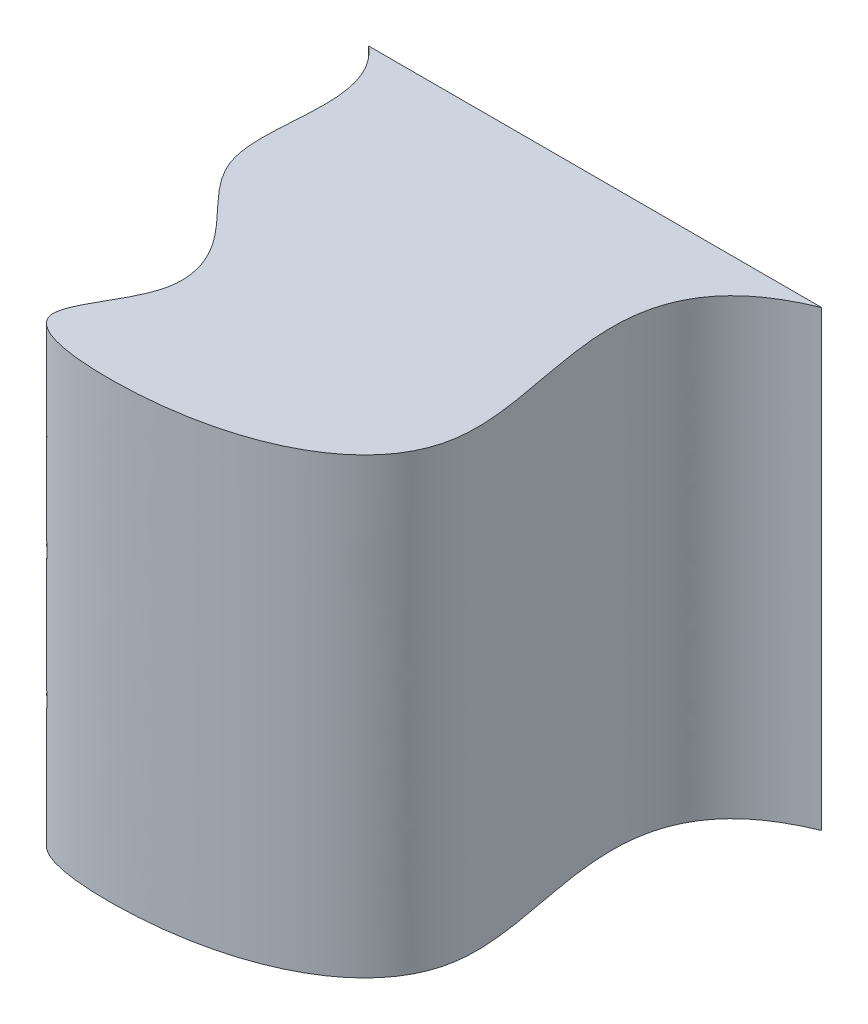
ISO-10303-21;
HEADER;
FILE_DESCRIPTION(('STEP AP214'),'2;1');
FILE_NAME('part.step','',(''),(''),'','','');
FILE_SCHEMA(('AUTOMOTIVE_DESIGN { 1 0 10303 214 1 1 1 1 }'));
ENDSEC;
DATA;
#1=APPLICATION_CONTEXT('core data for automotive mechanical design processes');
#2=APPLICATION_PROTOCOL_DEFINITION('international standard','automotive_design',2000,#1);
#3=PRODUCT_CONTEXT('',#1,'mechanical');
#4=PRODUCT('Part','Part','',(#3));
#5=PRODUCT_RELATED_PRODUCT_CATEGORY('part','',(#4));
#6=PRODUCT_DEFINITION_FORMATION('','',#4);
#7=PRODUCT_DEFINITION_CONTEXT('part definition',#1,'design');
#8=PRODUCT_DEFINITION('design','',#6,#7);
#9=PRODUCT_DEFINITION_SHAPE('','',#8);
#10=(LENGTH_UNIT() NAMED_UNIT(*) SI_UNIT(.MILLI.,.METRE.));
#11=(NAMED_UNIT(*) PLANE_ANGLE_UNIT() SI_UNIT($,.RADIAN.));
#12=(NAMED_UNIT(*) SI_UNIT($,.STERADIAN.) SOLID_ANGLE_UNIT());
#13=UNCERTAINTY_MEASURE_WITH_UNIT(LENGTH_MEASURE(1.E-05),#10,'distance_accuracy_value','');
#14=(GEOMETRIC_REPRESENTATION_CONTEXT(3) GLOBAL_UNCERTAINTY_ASSIGNED_CONTEXT((#13)) GLOBAL_UNIT_ASSIGNED_CONTEXT((#10,
#11,#12)) REPRESENTATION_CONTEXT('',''));
#15=CARTESIAN_POINT('',(0.,0.,0.));
#16=DIRECTION('',(0.,0.,1.));
#17=DIRECTION('',(1.,0.,0.));
#18=AXIS2_PLACEMENT_3D('',#15,#16,#17);
#19=CARTESIAN_POINT('',(0.,0.,300.));
#20=DIRECTION('',(0.,1.,0.));
#21=DIRECTION('',(0.,0.,1.));
#22=AXIS2_PLACEMENT_3D('',#19,#20,#21);
#23=PLANE('',#22);
#24=DIRECTION('',(1.,0.,0.));
#25=VECTOR('',#24,1.);
#26=CARTESIAN_POINT('',(0.,0.,0.));
#27=LINE('',#26,#25);
#28=CARTESIAN_POINT('',(0.,0.,0.));
#29=VERTEX_POINT('',#28);
#30=CARTESIAN_POINT('',(300.,0.,0.));
#31=VERTEX_POINT('',#30);
#32=EDGE_CURVE('E65',#29,#31,#27,.T.);
#33=ORIENTED_EDGE('',*,*,#32,.T.);
#34=CARTESIAN_POINT('',(300.,0.,0.));
#35=CARTESIAN_POINT('',(194.601714238655,0.,42.9835027080117));
#36=CARTESIAN_POINT('',(321.467545976425,0.,212.455352801679));
#37=CARTESIAN_POINT('',(158.683216248487,0.,285.515087254187));
#38=CARTESIAN_POINT('',(23.7939095909956,0.,271.005941294386));
#39=CARTESIAN_POINT('',(80.1316025792516,0.,212.407682336781));
#40=CARTESIAN_POINT('',(63.8759249444681,0.,155.994391090803));
#41=CARTESIAN_POINT('',(-8.35766294709991,0.,109.625530646416));
#42=CARTESIAN_POINT('',(35.1650281701012,0.,29.6523332625459));
#43=CARTESIAN_POINT('',(0.,0.,0.));
#44=B_SPLINE_CURVE_WITH_KNOTS('',3,(#34,#35,#36,#37,#38,#39,#40,#41,#42,#43),.UNSPECIFIED.,.F.,
.F.,(4,1,1,1,1,1,1,4),(0.,0.298458553614492,0.518711066495488,0.60818271615647,
0.690725835149107,0.741316597517548,0.83896485837528,1.),.UNSPECIFIED.);
#45=EDGE_CURVE('E56',#31,#29,#44,.T.);
#46=ORIENTED_EDGE('',*,*,#45,.T.);
#47=EDGE_LOOP('',(#33,#46));
#48=FACE_BOUND('',#47,.T.);
#49=ADVANCED_FACE('F37',(#48),#23,.F.);
#50=CARTESIAN_POINT('',(0.,300.,300.));
#51=DIRECTION('',(0.,-1.,0.));
#52=DIRECTION('',(0.,0.,-1.));
#53=AXIS2_PLACEMENT_3D('',#50,#51,#52);
#54=PLANE('',#53);
#55=DIRECTION('',(-1.,0.,0.));
#56=VECTOR('',#55,1.);
#57=CARTESIAN_POINT('',(0.,300.,0.));
#58=LINE('',#57,#56);
#59=CARTESIAN_POINT('',(300.,300.,0.));
#60=VERTEX_POINT('',#59);
#61=CARTESIAN_POINT('',(0.,300.,0.));
#62=VERTEX_POINT('',#61);
#63=EDGE_CURVE('E11',#60,#62,#58,.T.);
#64=ORIENTED_EDGE('',*,*,#63,.T.);
#65=CARTESIAN_POINT('',(300.,300.,0.));
#66=CARTESIAN_POINT('',(194.601714238655,300.,42.9835027080117));
#67=CARTESIAN_POINT('',(321.467545976425,300.,212.455352801679));
#68=CARTESIAN_POINT('',(158.683216248487,300.,285.515087254187));
#69=CARTESIAN_POINT('',(23.7939095909956,300.,271.005941294386));
#70=CARTESIAN_POINT('',(80.1316025792516,300.,212.407682336781));
#71=CARTESIAN_POINT('',(63.8759249444681,300.,155.994391090803));
#72=CARTESIAN_POINT('',(-8.35766294709991,300.,109.625530646416));
#73=CARTESIAN_POINT('',(35.1650281701012,300.,29.6523332625459));
#74=CARTESIAN_POINT('',(0.,300.,0.));
#75=B_SPLINE_CURVE_WITH_KNOTS('',3,(#65,#66,#67,#68,#69,#70,#71,#72,#73,#74),.UNSPECIFIED.,.F.,
.F.,(4,1,1,1,1,1,1,4),(0.,0.298458553614492,0.518711066495488,0.60818271615647,
0.690725835149107,0.741316597517548,0.83896485837528,1.),.UNSPECIFIED.);
#76=EDGE_CURVE('E51',#60,#62,#75,.T.);
#77=ORIENTED_EDGE('',*,*,#76,.F.);
#78=EDGE_LOOP('',(#64,#77));
#79=FACE_BOUND('',#78,.T.);
#80=ADVANCED_FACE('F67',(#79),#54,.F.);
#81=CARTESIAN_POINT('',(0.,0.,0.));
#82=DIRECTION('',(0.,0.,-1.));
#83=DIRECTION('',(-1.,0.,0.));
#84=AXIS2_PLACEMENT_3D('',#81,#82,#83);
#85=PLANE('',#84);
#86=DIRECTION('',(0.,-1.,0.));
#87=VECTOR('',#86,1.);
#88=CARTESIAN_POINT('',(0.,0.,0.));
#89=LINE('',#88,#87);
#90=EDGE_CURVE('E71',#62,#29,#89,.T.);
#91=ORIENTED_EDGE('',*,*,#90,.F.);
#92=ORIENTED_EDGE('',*,*,#63,.F.);
#93=DIRECTION('',(0.,1.,0.));
#94=VECTOR('',#93,1.);
#95=CARTESIAN_POINT('',(300.,0.,0.));
#96=LINE('',#95,#94);
#97=EDGE_CURVE('E44',#31,#60,#96,.T.);
#98=ORIENTED_EDGE('',*,*,#97,.F.);
#99=ORIENTED_EDGE('',*,*,#32,.F.);
#100=EDGE_LOOP('',(#91,#92,#98,#99));
#101=FACE_BOUND('',#100,.T.);
#102=ADVANCED_FACE('F70',(#101),#85,.T.);
#103=DIRECTION('',(0.,1.,0.));
#104=VECTOR('',#103,1.);
#105=SURFACE_OF_LINEAR_EXTRUSION('',#44,#104);
#106=ORIENTED_EDGE('',*,*,#76,.T.);
#107=ORIENTED_EDGE('',*,*,#90,.T.);
#108=ORIENTED_EDGE('',*,*,#45,.F.);
#109=ORIENTED_EDGE('',*,*,#97,.T.);
#110=EDGE_LOOP('',(#106,#107,#108,#109));
#111=FACE_BOUND('',#110,.T.);
#112=ADVANCED_FACE('F61',(#111),#105,.F.);
#113=CLOSED_SHELL('',(#49,#80,#102,#112));
#114=MANIFOLD_SOLID_BREP('B2',#113);
#115=ADVANCED_BREP_SHAPE_REPRESENTATION('',(#18,#114),#14);
#116=SHAPE_DEFINITION_REPRESENTATION(#9,#115);
ENDSEC;
END-ISO-10303-21;
